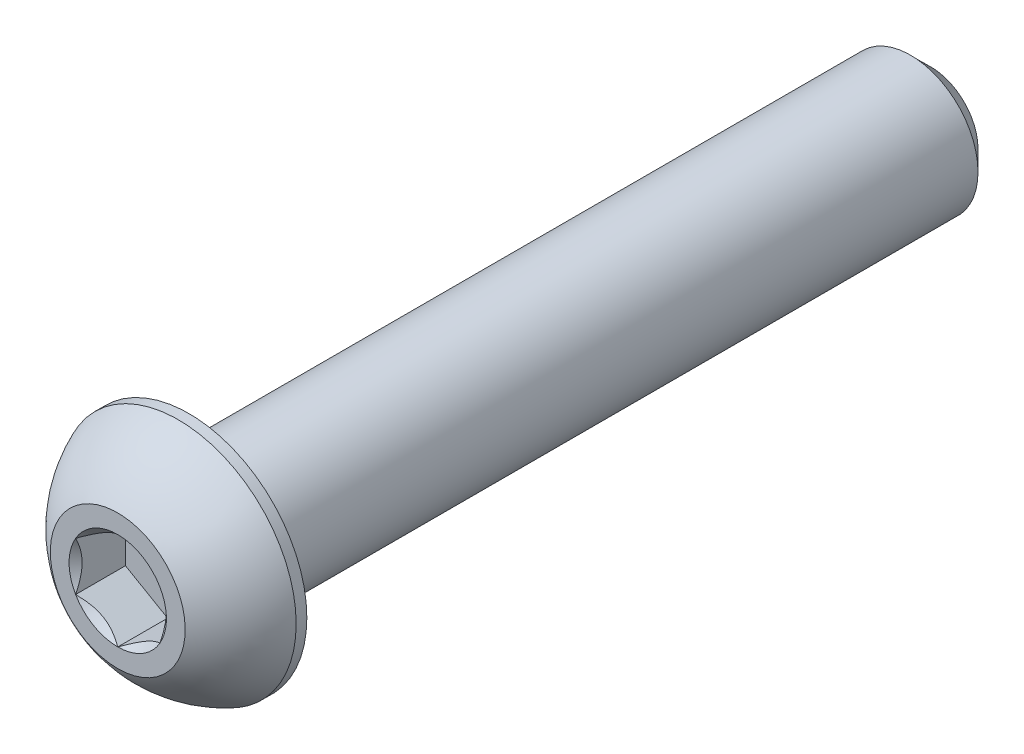
ISO-10303-21;
HEADER;
FILE_DESCRIPTION(('STEP AP214'),'2;1');
FILE_NAME('part.step','',(''),(''),'','','');
FILE_SCHEMA(('AUTOMOTIVE_DESIGN { 1 0 10303 214 1 1 1 1 }'));
ENDSEC;
DATA;
#1=APPLICATION_CONTEXT('core data for automotive mechanical design processes');
#2=APPLICATION_PROTOCOL_DEFINITION('international standard','automotive_design',2000,#1);
#3=PRODUCT_CONTEXT('',#1,'mechanical');
#4=PRODUCT('Part','Part','',(#3));
#5=PRODUCT_RELATED_PRODUCT_CATEGORY('part','',(#4));
#6=PRODUCT_DEFINITION_FORMATION('','',#4);
#7=PRODUCT_DEFINITION_CONTEXT('part definition',#1,'design');
#8=PRODUCT_DEFINITION('design','',#6,#7);
#9=PRODUCT_DEFINITION_SHAPE('','',#8);
#10=(LENGTH_UNIT() NAMED_UNIT(*) SI_UNIT(.MILLI.,.METRE.));
#11=(NAMED_UNIT(*) PLANE_ANGLE_UNIT() SI_UNIT($,.RADIAN.));
#12=(NAMED_UNIT(*) SI_UNIT($,.STERADIAN.) SOLID_ANGLE_UNIT());
#13=UNCERTAINTY_MEASURE_WITH_UNIT(LENGTH_MEASURE(1.E-05),#10,'distance_accuracy_value','');
#14=(GEOMETRIC_REPRESENTATION_CONTEXT(3) GLOBAL_UNCERTAINTY_ASSIGNED_CONTEXT((#13)) GLOBAL_UNIT_ASSIGNED_CONTEXT((#10,
#11,#12)) REPRESENTATION_CONTEXT('',''));
#15=CARTESIAN_POINT('',(0.,0.,0.));
#16=DIRECTION('',(0.,0.,1.));
#17=DIRECTION('',(1.,0.,0.));
#18=AXIS2_PLACEMENT_3D('',#15,#16,#17);
#19=CARTESIAN_POINT('',(0.,-3.175,-38.2778));
#20=DIRECTION('',(0.,0.,-1.));
#21=DIRECTION('',(0.,1.,0.));
#22=AXIS2_PLACEMENT_3D('',#19,#20,#21);
#23=PLANE('',#22);
#24=CARTESIAN_POINT('',(0.,0.,-38.2778));
#25=DIRECTION('',(0.,0.,-1.));
#26=DIRECTION('',(0.,1.,0.));
#27=AXIS2_PLACEMENT_3D('',#24,#25,#26);
#28=CIRCLE('',#27,2.2225);
#29=CARTESIAN_POINT('',(0.,-2.22249999999999,-38.2778));
#30=VERTEX_POINT('',#29);
#31=EDGE_CURVE('E181',#30,#30,#28,.T.);
#32=ORIENTED_EDGE('',*,*,#31,.T.);
#33=EDGE_LOOP('',(#32));
#34=FACE_BOUND('',#33,.T.);
#35=ADVANCED_FACE('F41',(#34),#23,.T.);
#36=CARTESIAN_POINT('',(0.,0.,-38.2778));
#37=DIRECTION('',(0.,0.,-1.));
#38=DIRECTION('',(0.,1.,0.));
#39=AXIS2_PLACEMENT_3D('',#36,#37,#38);
#40=CYLINDRICAL_SURFACE('',#39,3.175);
#41=CARTESIAN_POINT('',(0.,0.,-37.3253));
#42=DIRECTION('',(0.,0.,-1.));
#43=DIRECTION('',(0.,1.,0.));
#44=AXIS2_PLACEMENT_3D('',#41,#42,#43);
#45=CIRCLE('',#44,3.175);
#46=CARTESIAN_POINT('',(0.,-3.175,-37.3253));
#47=VERTEX_POINT('',#46);
#48=EDGE_CURVE('E55',#47,#47,#45,.F.);
#49=ORIENTED_EDGE('',*,*,#48,.T.);
#50=EDGE_LOOP('',(#49));
#51=FACE_BOUND('',#50,.T.);
#52=CARTESIAN_POINT('',(0.,0.,-3.3528));
#53=DIRECTION('',(0.,0.,1.));
#54=DIRECTION('',(1.,0.,0.));
#55=AXIS2_PLACEMENT_3D('',#52,#53,#54);
#56=CIRCLE('',#55,3.175);
#57=CARTESIAN_POINT('',(3.175,0.,-3.3528));
#58=VERTEX_POINT('',#57);
#59=EDGE_CURVE('E178',#58,#58,#56,.F.);
#60=ORIENTED_EDGE('',*,*,#59,.T.);
#61=EDGE_LOOP('',(#60));
#62=FACE_BOUND('',#61,.T.);
#63=ADVANCED_FACE('F186',(#51,#62),#40,.T.);
#64=CARTESIAN_POINT('',(0.,0.,-38.2778));
#65=DIRECTION('',(0.,0.,1.));
#66=DIRECTION('',(0.,-1.,0.));
#67=AXIS2_PLACEMENT_3D('',#64,#65,#66);
#68=CONICAL_SURFACE('',#67,2.2225,0.785398163397449);
#69=CARTESIAN_POINT('',(0.,-3.175,-37.3253));
#70=CARTESIAN_POINT('',(0.,-3.165078125,-37.335221875));
#71=CARTESIAN_POINT('',(0.,-3.15515625,-37.34514375));
#72=CARTESIAN_POINT('',(0.,-3.1353125,-37.3649875));
#73=CARTESIAN_POINT('',(0.,-3.125390625,-37.374909375));
#74=CARTESIAN_POINT('',(0.,-3.105546875,-37.394753125));
#75=CARTESIAN_POINT('',(0.,-3.095625,-37.404675));
#76=CARTESIAN_POINT('',(0.,-3.07578125,-37.42451875));
#77=CARTESIAN_POINT('',(0.,-3.065859375,-37.434440625));
#78=CARTESIAN_POINT('',(0.,-3.046015625,-37.454284375));
#79=CARTESIAN_POINT('',(0.,-3.03609375,-37.46420625));
#80=CARTESIAN_POINT('',(0.,-3.01625,-37.48405));
#81=CARTESIAN_POINT('',(0.,-3.006328125,-37.493971875));
#82=CARTESIAN_POINT('',(0.,-2.986484375,-37.513815625));
#83=CARTESIAN_POINT('',(0.,-2.9765625,-37.5237375));
#84=CARTESIAN_POINT('',(0.,-2.95671875,-37.54358125));
#85=CARTESIAN_POINT('',(0.,-2.946796875,-37.553503125));
#86=CARTESIAN_POINT('',(0.,-2.926953125,-37.573346875));
#87=CARTESIAN_POINT('',(0.,-2.91703125,-37.58326875));
#88=CARTESIAN_POINT('',(0.,-2.8971875,-37.6031125));
#89=CARTESIAN_POINT('',(0.,-2.887265625,-37.613034375));
#90=CARTESIAN_POINT('',(0.,-2.867421875,-37.632878125));
#91=CARTESIAN_POINT('',(0.,-2.8575,-37.6428));
#92=CARTESIAN_POINT('',(0.,-2.83765625,-37.66264375));
#93=CARTESIAN_POINT('',(0.,-2.827734375,-37.672565625));
#94=CARTESIAN_POINT('',(0.,-2.807890625,-37.692409375));
#95=CARTESIAN_POINT('',(0.,-2.79796875,-37.70233125));
#96=CARTESIAN_POINT('',(0.,-2.778125,-37.722175));
#97=CARTESIAN_POINT('',(0.,-2.768203125,-37.732096875));
#98=CARTESIAN_POINT('',(0.,-2.748359375,-37.751940625));
#99=CARTESIAN_POINT('',(0.,-2.7384375,-37.7618625));
#100=CARTESIAN_POINT('',(0.,-2.71859375,-37.78170625));
#101=CARTESIAN_POINT('',(0.,-2.708671875,-37.791628125));
#102=CARTESIAN_POINT('',(0.,-2.688828125,-37.811471875));
#103=CARTESIAN_POINT('',(0.,-2.67890624999999,-37.82139375));
#104=CARTESIAN_POINT('',(0.,-2.6590625,-37.8412375));
#105=CARTESIAN_POINT('',(0.,-2.649140625,-37.851159375));
#106=CARTESIAN_POINT('',(0.,-2.629296875,-37.871003125));
#107=CARTESIAN_POINT('',(0.,-2.619375,-37.880925));
#108=CARTESIAN_POINT('',(0.,-2.59953125,-37.90076875));
#109=CARTESIAN_POINT('',(0.,-2.589609375,-37.910690625));
#110=CARTESIAN_POINT('',(0.,-2.569765625,-37.930534375));
#111=CARTESIAN_POINT('',(0.,-2.55984375,-37.94045625));
#112=CARTESIAN_POINT('',(0.,-2.54,-37.9603));
#113=CARTESIAN_POINT('',(0.,-2.53007812499999,-37.970221875));
#114=CARTESIAN_POINT('',(0.,-2.510234375,-37.990065625));
#115=CARTESIAN_POINT('',(0.,-2.5003125,-37.9999875));
#116=CARTESIAN_POINT('',(0.,-2.48046875,-38.01983125));
#117=CARTESIAN_POINT('',(0.,-2.47054687499999,-38.029753125));
#118=CARTESIAN_POINT('',(0.,-2.45070312499999,-38.049596875));
#119=CARTESIAN_POINT('',(0.,-2.44078125,-38.05951875));
#120=CARTESIAN_POINT('',(0.,-2.4209375,-38.0793625));
#121=CARTESIAN_POINT('',(0.,-2.411015625,-38.089284375));
#122=CARTESIAN_POINT('',(0.,-2.391171875,-38.109128125));
#123=CARTESIAN_POINT('',(0.,-2.38124999999999,-38.11905));
#124=CARTESIAN_POINT('',(0.,-2.36140624999999,-38.13889375));
#125=CARTESIAN_POINT('',(0.,-2.351484375,-38.148815625));
#126=CARTESIAN_POINT('',(0.,-2.331640625,-38.168659375));
#127=CARTESIAN_POINT('',(0.,-2.32171874999999,-38.17858125));
#128=CARTESIAN_POINT('',(0.,-2.30187499999999,-38.198425));
#129=CARTESIAN_POINT('',(0.,-2.291953125,-38.208346875));
#130=CARTESIAN_POINT('',(0.,-2.272109375,-38.228190625));
#131=CARTESIAN_POINT('',(0.,-2.2621875,-38.2381125));
#132=CARTESIAN_POINT('',(0.,-2.24234374999999,-38.25795625));
#133=CARTESIAN_POINT('',(0.,-2.23242187499999,-38.267878125));
#134=CARTESIAN_POINT('',(0.,-2.22249999999999,-38.2778));
#135=B_SPLINE_CURVE_WITH_KNOTS('',3,(#69,#70,#71,#72,#73,#74,#75,#76,#77,#78,#79,#80,#81,#82,
#83,#84,#85,#86,#87,#88,#89,#90,#91,#92,#93,#94,#95,#96,#97,#98,#99,#100,#101,#102,#103,#104,
#105,#106,#107,#108,#109,#110,#111,#112,#113,#114,#115,#116,#117,#118,#119,#120,#121,#122,#123,
#124,#125,#126,#127,#128,#129,#130,#131,#132,#133,#134),.UNSPECIFIED.,.F.,.F.,(4,2,2,2,2,2,2,2,
2,2,2,2,2,2,2,2,2,2,2,2,2,2,2,2,2,2,2,2,2,2,2,2,4),(0.,0.0420949505675145,0.0841899011350244,
0.126284851702539,0.168379802270049,0.210474752837563,0.252569703405073,0.294664653972583,
0.336759604540098,0.378854555107608,0.420949505675122,0.463044456242632,0.505139406810142,
0.547234357377657,0.589329307945166,0.631424258512681,0.673519209080191,0.7156141596477,
0.757709110215215,0.799804060782725,0.84189901135024,0.883993961917749,0.926088912485259,
0.968183863052774,1.01027881362028,1.0523737641878,1.09446871475531,1.13656366532282,
1.17865861589033,1.22075356645784,1.26284851702536,1.30494346759287,1.34703841816038),.UNSPECIFIED.);
#136=EDGE_CURVE('BSEAM43',#47,#30,#135,.T.);
#137=ORIENTED_EDGE('',*,*,#48,.F.);
#138=ORIENTED_EDGE('',*,*,#31,.F.);
#139=ORIENTED_EDGE('',*,*,#136,.T.);
#140=ORIENTED_EDGE('',*,*,#136,.F.);
#141=EDGE_LOOP('',(#137,#139,#138,#140));
#142=FACE_BOUND('',#141,.T.);
#143=ADVANCED_FACE('F43',(#142),#68,.T.);
#144=CARTESIAN_POINT('',(0.,0.,-5.060315));
#145=DIRECTION('',(0.,0.,1.));
#146=DIRECTION('',(0.,-1.,0.));
#147=AXIS2_PLACEMENT_3D('',#144,#145,#146);
#148=SPHERICAL_SURFACE('',#147,5.97389428256184);
#149=CARTESIAN_POINT('',(0.,0.,0.));
#150=DIRECTION('',(0.,0.,1.));
#151=DIRECTION('',(1.,0.,0.));
#152=AXIS2_PLACEMENT_3D('',#149,#150,#151);
#153=CIRCLE('',#152,3.175);
#154=CARTESIAN_POINT('',(0.,-3.175,0.));
#155=VERTEX_POINT('',#154);
#156=EDGE_CURVE('E175',#155,#155,#153,.T.);
#157=CARTESIAN_POINT('',(0.,0.,-2.84988));
#158=DIRECTION('',(0.,0.,1.));
#159=DIRECTION('',(1.,0.,0.));
#160=AXIS2_PLACEMENT_3D('',#157,#158,#159);
#161=CIRCLE('',#160,5.5499);
#162=CARTESIAN_POINT('',(0.,-5.5499,-2.84988));
#163=VERTEX_POINT('',#162);
#164=EDGE_CURVE('E169',#163,#163,#161,.T.);
#165=CARTESIAN_POINT('',(0.,-3.175,0.));
#166=CARTESIAN_POINT('',(0.,-3.20828343957184,-0.0208830076580488));
#167=CARTESIAN_POINT('',(0.,-3.24136078860705,-0.0420944789280492));
#168=CARTESIAN_POINT('',(0.,-3.3070905577514,-0.0851658910984713));
#169=CARTESIAN_POINT('',(0.,-3.33974297786056,-0.107025831998893));
#170=CARTESIAN_POINT('',(0.,-3.40461014130008,-0.151385725836676));
#171=CARTESIAN_POINT('',(0.,-3.43682488463043,-0.173885678774038));
#172=CARTESIAN_POINT('',(0.,-3.50080416139461,-0.219516822259478));
#173=CARTESIAN_POINT('',(0.,-3.53256869482844,-0.242648012807557));
#174=CARTESIAN_POINT('',(0.,-3.59563518208834,-0.289532629449102));
#175=CARTESIAN_POINT('',(0.,-3.62693713591442,-0.313286055542568));
#176=CARTESIAN_POINT('',(0.,-3.68906627753106,-0.361405894091329));
#177=CARTESIAN_POINT('',(0.,-3.71989346532163,-0.385772306546625));
#178=CARTESIAN_POINT('',(0.,-3.78106107243204,-0.435108631276876));
#179=CARTESIAN_POINT('',(0.,-3.81140149175189,-0.460078543551832));
#180=CARTESIAN_POINT('',(0.,-3.87158374923259,-0.510612146063937));
#181=CARTESIAN_POINT('',(0.,-3.90142558739343,-0.536175836301086));
#182=CARTESIAN_POINT('',(0.,-3.96059906392414,-0.587887041792083));
#183=CARTESIAN_POINT('',(0.,-3.989930702294,-0.614034557045931));
#184=CARTESIAN_POINT('',(0.,-4.04807235926832,-0.666903232293406));
#185=CARTESIAN_POINT('',(0.,-4.07688237787279,-0.693624392287033));
#186=CARTESIAN_POINT('',(0.,-4.13396957842491,-0.747629953401057));
#187=CARTESIAN_POINT('',(0.,-4.16224676037256,-0.774914354521453));
#188=CARTESIAN_POINT('',(0.,-4.21825727817542,-0.830035774981947));
#189=CARTESIAN_POINT('',(0.,-4.24599061403061,-0.857872794322044));
#190=CARTESIAN_POINT('',(0.,-4.30090264195357,-0.91408861315902));
#191=CARTESIAN_POINT('',(0.,-4.32808133402134,-0.942467412655899));
#192=CARTESIAN_POINT('',(0.,-4.38187349261952,-0.999755742806741));
#193=CARTESIAN_POINT('',(0.,-4.40848695914995,-1.0286652734607));
#194=CARTESIAN_POINT('',(0.,-4.46113830498838,-1.08700381029123));
#195=CARTESIAN_POINT('',(0.,-4.48717618429639,-1.11643281646778));
#196=CARTESIAN_POINT('',(0.,-4.53866621810402,-1.17579884645643));
#197=CARTESIAN_POINT('',(0.,-4.56411837260364,-1.20573587026853));
#198=CARTESIAN_POINT('',(0.,-4.61442704725457,-1.26610627984964));
#199=CARTESIAN_POINT('',(0.,-4.63928356740587,-1.29653966561866));
#200=CARTESIAN_POINT('',(0.,-4.68839129572448,-1.3578909501815));
#201=CARTESIAN_POINT('',(0.,-4.71264250389178,-1.38880884897531));
#202=CARTESIAN_POINT('',(0.,-4.76053016627881,-1.45111712201534));
#203=CARTESIAN_POINT('',(0.,-4.78416662049853,-1.48250749626155));
#204=CARTESIAN_POINT('',(0.,-4.8308155723751,-1.54574849868041));
#205=CARTESIAN_POINT('',(0.,-4.85382807003194,-1.57759912685306));
#206=CARTESIAN_POINT('',(0.,-4.89922014909859,-1.64174823640362));
#207=CARTESIAN_POINT('',(0.,-4.92159973050841,-1.67404671778154));
#208=CARTESIAN_POINT('',(0.,-4.96571726381658,-1.73907895865427));
#209=CARTESIAN_POINT('',(0.,-4.98745521571493,-1.77181271814908));
#210=CARTESIAN_POINT('',(0.,-5.03028102654719,-1.83770277069632));
#211=CARTESIAN_POINT('',(0.,-5.0513688854811,-1.87085906374874));
#212=CARTESIAN_POINT('',(0.,-5.09288630004063,-1.93758127434189));
#213=CARTESIAN_POINT('',(0.,-5.11331585566624,-1.97114719188261));
#214=CARTESIAN_POINT('',(0.,-5.15350870956168,-2.03867558290299));
#215=CARTESIAN_POINT('',(0.,-5.17327200783151,-2.07263805638265));
#216=CARTESIAN_POINT('',(0.,-5.21212465239608,-2.14094633632486));
#217=CARTESIAN_POINT('',(0.,-5.23121399869082,-2.17529214278741));
#218=CARTESIAN_POINT('',(0.,-5.26871130697935,-2.2443537165359));
#219=CARTESIAN_POINT('',(0.,-5.28711926897315,-2.27906948382184));
#220=CARTESIAN_POINT('',(0.,-5.32324664200827,-2.3488574628552));
#221=CARTESIAN_POINT('',(0.,-5.3409660530496,-2.38392967460262));
#222=CARTESIAN_POINT('',(0.,-5.37570942417474,-2.45441688802313));
#223=CARTESIAN_POINT('',(0.,-5.39273338425856,-2.48983188969622));
#224=CARTESIAN_POINT('',(0.,-5.42607922958184,-2.56099089271574));
#225=CARTESIAN_POINT('',(0.,-5.44240111482132,-2.59673489406217));
#226=CARTESIAN_POINT('',(0.,-5.47433643994316,-2.66853798649801));
#227=CARTESIAN_POINT('',(0.,-5.48994987982553,-2.70459707758742));
#228=CARTESIAN_POINT('',(0.,-5.52046229408188,-2.77701628549785));
#229=CARTESIAN_POINT('',(0.,-5.53536126845586,-2.81337640231887));
#230=CARTESIAN_POINT('',(0.,-5.5499,-2.84988));
#231=B_SPLINE_CURVE_WITH_KNOTS('',3,(#165,#166,#167,#168,#169,#170,#171,#172,#173,#174,#175,
#176,#177,#178,#179,#180,#181,#182,#183,#184,#185,#186,#187,#188,#189,#190,#191,#192,#193,#194,
#195,#196,#197,#198,#199,#200,#201,#202,#203,#204,#205,#206,#207,#208,#209,#210,#211,#212,#213,
#214,#215,#216,#217,#218,#219,#220,#221,#222,#223,#224,#225,#226,#227,#228,#229,#230),
.UNSPECIFIED.,.F.,.F.,(4,2,2,2,2,2,2,2,2,2,2,2,2,2,2,2,2,2,2,2,2,2,2,2,2,2,2,2,2,2,2,2,4),(0.,
0.1178750807537,0.2357501615074,0.353625242261099,0.471500323014799,0.589375403768499,
0.707250484522198,0.825125565275897,0.943000646029598,1.0608757267833,1.178750807537,
1.2966258882907,1.41450096904439,1.53237604979809,1.65025113055179,1.76812621130549,
1.88600129205919,2.00387637281289,2.12175145356659,2.23962653432029,2.35750161507399,
2.47537669582769,2.59325177658139,2.71112685733509,2.82900193808879,2.94687701884249,
3.06475209959619,3.18262718034989,3.30050226110359,3.41837734185729,3.53625242261099,
3.65412750336469,3.77200258411839),.UNSPECIFIED.);
#232=EDGE_CURVE('BSEAM191',#155,#163,#231,.T.);
#233=ORIENTED_EDGE('',*,*,#156,.F.);
#234=ORIENTED_EDGE('',*,*,#164,.T.);
#235=ORIENTED_EDGE('',*,*,#232,.T.);
#236=ORIENTED_EDGE('',*,*,#232,.F.);
#237=EDGE_LOOP('',(#233,#235,#234,#236));
#238=FACE_BOUND('',#237,.T.);
#239=ADVANCED_FACE('F191',(#238),#148,.T.);
#240=CARTESIAN_POINT('',(0.,-3.175,0.));
#241=DIRECTION('',(0.,0.,-1.));
#242=DIRECTION('',(-1.,0.,0.));
#243=AXIS2_PLACEMENT_3D('',#240,#241,#242);
#244=PLANE('',#243);
#245=CARTESIAN_POINT('',(0.,0.,0.));
#246=DIRECTION('',(0.,0.,1.));
#247=DIRECTION('',(1.,0.,0.));
#248=AXIS2_PLACEMENT_3D('',#245,#246,#247);
#249=CIRCLE('',#248,2.29135888084633);
#250=CARTESIAN_POINT('',(-1.984375,1.14567944042316,0.));
#251=VERTEX_POINT('',#250);
#252=CARTESIAN_POINT('',(-1.984375,-1.14567944042316,0.));
#253=VERTEX_POINT('',#252);
#254=EDGE_CURVE('E68',#251,#253,#249,.T.);
#255=ORIENTED_EDGE('',*,*,#254,.F.);
#256=CARTESIAN_POINT('',(0.,2.29135888084633,0.));
#257=VERTEX_POINT('',#256);
#258=EDGE_CURVE('E140',#257,#251,#249,.T.);
#259=ORIENTED_EDGE('',*,*,#258,.F.);
#260=CARTESIAN_POINT('',(1.984375,1.14567944042316,0.));
#261=VERTEX_POINT('',#260);
#262=EDGE_CURVE('E137',#261,#257,#249,.T.);
#263=ORIENTED_EDGE('',*,*,#262,.F.);
#264=CARTESIAN_POINT('',(1.984375,-1.14567944042316,0.));
#265=VERTEX_POINT('',#264);
#266=EDGE_CURVE('E108',#265,#261,#249,.T.);
#267=ORIENTED_EDGE('',*,*,#266,.F.);
#268=CARTESIAN_POINT('',(0.,-2.29135888084633,0.));
#269=VERTEX_POINT('',#268);
#270=EDGE_CURVE('E100',#269,#265,#249,.T.);
#271=ORIENTED_EDGE('',*,*,#270,.F.);
#272=EDGE_CURVE('E61',#253,#269,#249,.T.);
#273=ORIENTED_EDGE('',*,*,#272,.F.);
#274=EDGE_LOOP('',(#255,#259,#263,#267,#271,#273));
#275=FACE_BOUND('',#274,.T.);
#276=ORIENTED_EDGE('',*,*,#156,.T.);
#277=EDGE_LOOP('',(#276));
#278=FACE_BOUND('',#277,.T.);
#279=ADVANCED_FACE('F134',(#275,#278),#244,.F.);
#280=CARTESIAN_POINT('',(0.,-5.5499,-3.3528));
#281=DIRECTION('',(0.,0.,1.));
#282=DIRECTION('',(1.,0.,0.));
#283=AXIS2_PLACEMENT_3D('',#280,#281,#282);
#284=PLANE('',#283);
#285=ORIENTED_EDGE('',*,*,#59,.F.);
#286=EDGE_LOOP('',(#285));
#287=FACE_BOUND('',#286,.T.);
#288=CARTESIAN_POINT('',(0.,0.,-3.3528));
#289=DIRECTION('',(0.,0.,1.));
#290=DIRECTION('',(1.,0.,0.));
#291=AXIS2_PLACEMENT_3D('',#288,#289,#290);
#292=CIRCLE('',#291,5.5499);
#293=CARTESIAN_POINT('',(5.5499,0.,-3.3528));
#294=VERTEX_POINT('',#293);
#295=EDGE_CURVE('E172',#294,#294,#292,.T.);
#296=ORIENTED_EDGE('',*,*,#295,.F.);
#297=EDGE_LOOP('',(#296));
#298=FACE_BOUND('',#297,.T.);
#299=ADVANCED_FACE('F205',(#287,#298),#284,.F.);
#300=CARTESIAN_POINT('',(0.,0.,0.));
#301=DIRECTION('',(0.,0.,1.));
#302=DIRECTION('',(1.,0.,0.));
#303=AXIS2_PLACEMENT_3D('',#300,#301,#302);
#304=CYLINDRICAL_SURFACE('',#303,5.5499);
#305=ORIENTED_EDGE('',*,*,#164,.F.);
#306=EDGE_LOOP('',(#305));
#307=FACE_BOUND('',#306,.T.);
#308=ORIENTED_EDGE('',*,*,#295,.T.);
#309=EDGE_LOOP('',(#308));
#310=FACE_BOUND('',#309,.T.);
#311=ADVANCED_FACE('F208',(#307,#310),#304,.T.);
#312=CARTESIAN_POINT('',(0.,0.,0.));
#313=DIRECTION('',(0.,0.,1.));
#314=DIRECTION('',(1.,0.,0.));
#315=AXIS2_PLACEMENT_3D('',#312,#313,#314);
#316=CONICAL_SURFACE('',#315,2.29135888084633,0.78539816339745);
#317=ORIENTED_EDGE('',*,*,#266,.T.);
#318=CARTESIAN_POINT('',(1.984375,-2.28495242157822,0.734984078816568));
#319=CARTESIAN_POINT('',(1.984375,-2.22931635455402,0.692986685550761));
#320=CARTESIAN_POINT('',(1.984375,-2.17336876548389,0.651396054076336));
#321=CARTESIAN_POINT('',(1.984375,-2.06072770258171,0.569208461471479));
#322=CARTESIAN_POINT('',(1.984375,-2.00403404503435,0.528611752405042));
#323=CARTESIAN_POINT('',(1.984375,-1.88936329173488,0.448303503174669));
#324=CARTESIAN_POINT('',(1.984375,-1.83137965519348,0.408601258813307));
#325=CARTESIAN_POINT('',(1.984375,-1.7144280213784,0.330685173401292));
#326=CARTESIAN_POINT('',(1.984375,-1.65546009407228,0.292471227194368));
#327=CARTESIAN_POINT('',(1.984375,-1.47005472306035,0.176252834013636));
#328=CARTESIAN_POINT('',(1.984375,-1.34163909427883,0.101347886872381));
#329=CARTESIAN_POINT('',(1.984375,-1.0784038470548,-0.0356697845602626));
#330=CARTESIAN_POINT('',(1.984375,-0.943607781407425,-0.0978256335176257));
#331=CARTESIAN_POINT('',(1.984375,-0.741275100444882,-0.173867421311381));
#332=CARTESIAN_POINT('',(1.984375,-0.676735408881095,-0.195691938673995));
#333=CARTESIAN_POINT('',(1.984375,-0.546098118112762,-0.234159536462205));
#334=CARTESIAN_POINT('',(1.984375,-0.480000411919956,-0.250802259934452));
#335=CARTESIAN_POINT('',(1.984375,-0.347746170028532,-0.277764619130277));
#336=CARTESIAN_POINT('',(1.984375,-0.281612071479123,-0.288192590264108));
#337=CARTESIAN_POINT('',(1.984375,-0.14863662005235,-0.302521852623404));
#338=CARTESIAN_POINT('',(1.984375,-0.0817953907393235,-0.306424265772614));
#339=CARTESIAN_POINT('',(1.984375,0.0495156750890646,-0.307412948667328));
#340=CARTESIAN_POINT('',(1.984375,0.113983775102992,-0.304740821124985));
#341=CARTESIAN_POINT('',(1.984375,0.242367515846177,-0.293260789502485));
#342=CARTESIAN_POINT('',(1.984375,0.30628310229592,-0.284452289360786));
#343=CARTESIAN_POINT('',(1.984375,0.434181040262184,-0.261030978667103));
#344=CARTESIAN_POINT('',(1.984375,0.498145026858309,-0.246319393767914));
#345=CARTESIAN_POINT('',(1.984375,0.624675616953007,-0.211873818587874));
#346=CARTESIAN_POINT('',(1.984375,0.687242336899689,-0.192140248550805));
#347=CARTESIAN_POINT('',(1.984375,0.884225483826087,-0.12258776276924));
#348=CARTESIAN_POINT('',(1.984375,1.01583674256468,-0.0648475887435035));
#349=CARTESIAN_POINT('',(1.984375,1.27288659242652,0.0635303365887973));
#350=CARTESIAN_POINT('',(1.984375,1.3983008827048,0.134214424919412));
#351=CARTESIAN_POINT('',(1.984375,1.57956687990221,0.244516663813198));
#352=CARTESIAN_POINT('',(1.984375,1.63738271299424,0.280969829475363));
#353=CARTESIAN_POINT('',(1.984375,1.75202215386201,0.355415963291704));
#354=CARTESIAN_POINT('',(1.984375,1.80884568601361,0.393409048078053));
#355=CARTESIAN_POINT('',(1.984375,1.92116923084255,0.470338808893089));
#356=CARTESIAN_POINT('',(1.984375,1.97667624512253,0.50926531303879));
#357=CARTESIAN_POINT('',(1.984375,2.08693170717166,0.588147746121385));
#358=CARTESIAN_POINT('',(1.984375,2.14168035934792,0.628103389024029));
#359=CARTESIAN_POINT('',(1.984375,2.19611149046622,0.668480611285425));
#360=B_SPLINE_CURVE_WITH_KNOTS('',3,(#318,#319,#320,#321,#322,#323,#324,#325,#326,#327,#328,
#329,#330,#331,#332,#333,#334,#335,#336,#337,#338,#339,#340,#341,#342,#343,#344,#345,#346,#347,
#348,#349,#350,#351,#352,#353,#354,#355,#356,#357,#358,#359),.UNSPECIFIED.,.F.,.F.,(4,2,2,2,2,2,
2,2,2,2,2,2,2,2,2,2,2,2,2,2,4),(0.,0.209126070008322,0.418304637356569,0.629103979977992,
0.839888401371185,1.28549951116127,1.72957750768351,1.93379389749971,2.13802435186698,
2.33858179514334,2.53910475350639,2.73236963400794,2.92565329006887,3.12231577097487,
3.31896180041345,3.74886295245172,4.18033428125362,4.3853601718029,4.59040161996382,
4.79377749165107,4.99709743524131),.UNSPECIFIED.);
#361=EDGE_CURVE('E11',#265,#261,#360,.T.);
#362=ORIENTED_EDGE('',*,*,#361,.F.);
#363=EDGE_LOOP('',(#317,#362));
#364=FACE_BOUND('',#363,.T.);
#365=ADVANCED_FACE('F112',(#364),#316,.F.);
#366=ORIENTED_EDGE('',*,*,#262,.T.);
#367=CARTESIAN_POINT('',(1.984575,1.14556397036933,0.000115478781843379));
#368=CARTESIAN_POINT('',(1.9163590048332,1.18494849354192,-0.0392371477360852));
#369=CARTESIAN_POINT('',(1.84700231489303,1.22499159714897,-0.0762786895538154));
#370=CARTESIAN_POINT('',(1.70557619954781,1.30664400291398,-0.144101141576677));
#371=CARTESIAN_POINT('',(1.63349332126322,1.34826107209555,-0.174844310908246));
#372=CARTESIAN_POINT('',(1.488141602734,1.43217992591557,-0.227508111188786));
#373=CARTESIAN_POINT('',(1.41490978751306,1.47446033414663,-0.249561124120036));
#374=CARTESIAN_POINT('',(1.26683381740529,1.55995203534886,-0.283538507056124));
#375=CARTESIAN_POINT('',(1.19199418724658,1.60316071596705,-0.295488243908272));
#376=CARTESIAN_POINT('',(1.06301458545618,1.6776271237807,-0.306269900918094));
#377=CARTESIAN_POINT('',(1.00904128422756,1.7087886237741,-0.30786610094093));
#378=CARTESIAN_POINT('',(0.901182881480199,1.77106070163465,-0.305178161134708));
#379=CARTESIAN_POINT('',(0.847297817514476,1.80217125782056,-0.300891959659541));
#380=CARTESIAN_POINT('',(0.740036461751395,1.86409863044402,-0.286683126986481));
#381=CARTESIAN_POINT('',(0.686660807239859,1.89491507894443,-0.276754189547727));
#382=CARTESIAN_POINT('',(0.580832482591103,1.95601509066828,-0.251804915725461));
#383=CARTESIAN_POINT('',(0.528379742028898,1.9862986945516,-0.236784969610512));
#384=CARTESIAN_POINT('',(0.394017661036351,2.06387267818152,-0.19219214836433));
#385=CARTESIAN_POINT('',(0.312941642841675,2.11068193911104,-0.159257004061668));
#386=CARTESIAN_POINT('',(0.19372669327016,2.17951072233758,-0.103657558797803));
#387=CARTESIAN_POINT('',(0.154440075613998,2.20219286161692,-0.0841224079481377));
#388=CARTESIAN_POINT('',(0.0765946381319466,2.24713694590237,-0.0432712618805983));
#389=CARTESIAN_POINT('',(0.0380353888983007,2.26939913882716,-0.0219563604316494));
#390=CARTESIAN_POINT('',(-0.000200000000000694,2.29147435090017,0.000115478781842942));
#391=B_SPLINE_CURVE_WITH_KNOTS('',3,(#367,#368,#369,#370,#371,#372,#373,#374,#375,#376,#377,
#378,#379,#380,#381,#382,#383,#384,#385,#386,#387,#388,#389,#390),.UNSPECIFIED.,.F.,.F.,(4,2,2,
2,2,2,2,2,2,2,2,4),(0.,0.264339630306627,0.530219665093694,0.791876416371461,1.05287424418109,
1.239639843932,1.42647091743852,1.61351120244035,1.8005371524754,2.09764209964316,
2.24579179873714,2.39385111134157),.UNSPECIFIED.);
#392=EDGE_CURVE('E139',#261,#257,#391,.T.);
#393=ORIENTED_EDGE('',*,*,#392,.F.);
#394=EDGE_LOOP('',(#366,#393));
#395=FACE_BOUND('',#394,.T.);
#396=ADVANCED_FACE('F293',(#395),#316,.F.);
#397=ORIENTED_EDGE('',*,*,#258,.T.);
#398=CARTESIAN_POINT('',(0.000199999999999584,2.29147435090017,0.000115478781843248));
#399=CARTESIAN_POINT('',(-0.0680159951668027,2.25208982772757,-0.0392371477360854));
#400=CARTESIAN_POINT('',(-0.137372685106966,2.21204672412052,-0.0762786895538155));
#401=CARTESIAN_POINT('',(-0.278798800452188,2.13039431835551,-0.144101141576677));
#402=CARTESIAN_POINT('',(-0.350881678736783,2.08877724917394,-0.174844310908246));
#403=CARTESIAN_POINT('',(-0.496233397266004,2.00485839535392,-0.227508111188786));
#404=CARTESIAN_POINT('',(-0.569465212486939,1.96257798712287,-0.249561124120036));
#405=CARTESIAN_POINT('',(-0.717541182594707,1.87708628592063,-0.283538507056124));
#406=CARTESIAN_POINT('',(-0.792380812753425,1.83387760530244,-0.295488243908272));
#407=CARTESIAN_POINT('',(-0.921360414543816,1.75941119748879,-0.306269900918094));
#408=CARTESIAN_POINT('',(-0.975333715772443,1.72824969749539,-0.307866100940931));
#409=CARTESIAN_POINT('',(-1.0831921185198,1.66597761963484,-0.305178161134708));
#410=CARTESIAN_POINT('',(-1.13707718248552,1.63486706344893,-0.300891959659541));
#411=CARTESIAN_POINT('',(-1.2443385382486,1.57293969082547,-0.286683126986481));
#412=CARTESIAN_POINT('',(-1.29771419276014,1.54212324232506,-0.276754189547727));
#413=CARTESIAN_POINT('',(-1.4035425174089,1.48102323060122,-0.251804915725462));
#414=CARTESIAN_POINT('',(-1.4559952579711,1.45073962671789,-0.236784969610512));
#415=CARTESIAN_POINT('',(-1.59035733896365,1.37316564308797,-0.19219214836433));
#416=CARTESIAN_POINT('',(-1.67143335715832,1.32635638215845,-0.159257004061668));
#417=CARTESIAN_POINT('',(-1.79064830672984,1.25752759893191,-0.103657558797804));
#418=CARTESIAN_POINT('',(-1.829934924386,1.23484545965257,-0.0841224079481378));
#419=CARTESIAN_POINT('',(-1.90778036186805,1.18990137536712,-0.0432712618805986));
#420=CARTESIAN_POINT('',(-1.9463396111017,1.16763918244233,-0.0219563604316498));
#421=CARTESIAN_POINT('',(-1.984575,1.14556397036933,0.000115478781842511));
#422=B_SPLINE_CURVE_WITH_KNOTS('',3,(#398,#399,#400,#401,#402,#403,#404,#405,#406,#407,#408,
#409,#410,#411,#412,#413,#414,#415,#416,#417,#418,#419,#420,#421),.UNSPECIFIED.,.F.,.F.,(4,2,2,
2,2,2,2,2,2,2,2,4),(0.,0.264339630306627,0.530219665093694,0.791876416371461,1.05287424418109,
1.239639843932,1.42647091743852,1.61351120244035,1.8005371524754,2.09764209964316,
2.24579179873714,2.39385111134157),.UNSPECIFIED.);
#423=EDGE_CURVE('E144',#257,#251,#422,.T.);
#424=ORIENTED_EDGE('',*,*,#423,.F.);
#425=EDGE_LOOP('',(#397,#424));
#426=FACE_BOUND('',#425,.T.);
#427=ADVANCED_FACE('F147',(#426),#316,.F.);
#428=ORIENTED_EDGE('',*,*,#254,.T.);
#429=CARTESIAN_POINT('',(-1.984375,-2.28495242157822,0.734984078816568));
#430=CARTESIAN_POINT('',(-1.984375,-2.22931635455402,0.692986685550762));
#431=CARTESIAN_POINT('',(-1.984375,-2.17336876548389,0.651396054076336));
#432=CARTESIAN_POINT('',(-1.984375,-2.06072770258171,0.569208461471479));
#433=CARTESIAN_POINT('',(-1.984375,-2.00403404503435,0.528611752405043));
#434=CARTESIAN_POINT('',(-1.984375,-1.88936329173489,0.448303503174669));
#435=CARTESIAN_POINT('',(-1.984375,-1.83137965519348,0.408601258813307));
#436=CARTESIAN_POINT('',(-1.984375,-1.7144280213784,0.330685173401292));
#437=CARTESIAN_POINT('',(-1.984375,-1.65546009407228,0.292471227194368));
#438=CARTESIAN_POINT('',(-1.984375,-1.47005472306035,0.176252834013636));
#439=CARTESIAN_POINT('',(-1.984375,-1.34163909427883,0.101347886872381));
#440=CARTESIAN_POINT('',(-1.984375,-1.0784038470548,-0.0356697845602625));
#441=CARTESIAN_POINT('',(-1.984375,-0.943607781407425,-0.0978256335176254));
#442=CARTESIAN_POINT('',(-1.984375,-0.741275100444882,-0.173867421311381));
#443=CARTESIAN_POINT('',(-1.984375,-0.676735408881095,-0.195691938673995));
#444=CARTESIAN_POINT('',(-1.984375,-0.546098118112762,-0.234159536462205));
#445=CARTESIAN_POINT('',(-1.984375,-0.480000411919956,-0.250802259934452));
#446=CARTESIAN_POINT('',(-1.984375,-0.347746170028532,-0.277764619130277));
#447=CARTESIAN_POINT('',(-1.984375,-0.281612071479123,-0.288192590264108));
#448=CARTESIAN_POINT('',(-1.984375,-0.14863662005235,-0.302521852623404));
#449=CARTESIAN_POINT('',(-1.984375,-0.0817953907393238,-0.306424265772614));
#450=CARTESIAN_POINT('',(-1.984375,0.0495156750890643,-0.307412948667328));
#451=CARTESIAN_POINT('',(-1.984375,0.113983775102991,-0.304740821124985));
#452=CARTESIAN_POINT('',(-1.984375,0.242367515846177,-0.293260789502485));
#453=CARTESIAN_POINT('',(-1.984375,0.306283102295919,-0.284452289360786));
#454=CARTESIAN_POINT('',(-1.984375,0.434181040262184,-0.261030978667103));
#455=CARTESIAN_POINT('',(-1.984375,0.498145026858309,-0.246319393767914));
#456=CARTESIAN_POINT('',(-1.984375,0.624675616953007,-0.211873818587874));
#457=CARTESIAN_POINT('',(-1.984375,0.687242336899689,-0.192140248550805));
#458=CARTESIAN_POINT('',(-1.984375,0.884225483826087,-0.12258776276924));
#459=CARTESIAN_POINT('',(-1.984375,1.01583674256468,-0.0648475887435032));
#460=CARTESIAN_POINT('',(-1.984375,1.27288659242652,0.0635303365887978));
#461=CARTESIAN_POINT('',(-1.984375,1.3983008827048,0.134214424919412));
#462=CARTESIAN_POINT('',(-1.984375,1.57956687990221,0.244516663813198));
#463=CARTESIAN_POINT('',(-1.984375,1.63738271299424,0.280969829475363));
#464=CARTESIAN_POINT('',(-1.984375,1.75202215386202,0.355415963291704));
#465=CARTESIAN_POINT('',(-1.984375,1.80884568601362,0.393409048078053));
#466=CARTESIAN_POINT('',(-1.984375,1.92116923084255,0.47033880889309));
#467=CARTESIAN_POINT('',(-1.984375,1.97667624512253,0.509265313038791));
#468=CARTESIAN_POINT('',(-1.984375,2.08693170717166,0.588147746121386));
#469=CARTESIAN_POINT('',(-1.984375,2.14168035934793,0.628103389024029));
#470=CARTESIAN_POINT('',(-1.984375,2.19611149046622,0.668480611285426));
#471=B_SPLINE_CURVE_WITH_KNOTS('',3,(#429,#430,#431,#432,#433,#434,#435,#436,#437,#438,#439,
#440,#441,#442,#443,#444,#445,#446,#447,#448,#449,#450,#451,#452,#453,#454,#455,#456,#457,#458,
#459,#460,#461,#462,#463,#464,#465,#466,#467,#468,#469,#470),.UNSPECIFIED.,.F.,.F.,(4,2,2,2,2,2,
2,2,2,2,2,2,2,2,2,2,2,2,2,2,4),(0.,0.209126070008322,0.41830463735657,0.629103979977993,
0.839888401371186,1.28549951116127,1.72957750768351,1.93379389749972,2.13802435186698,
2.33858179514334,2.53910475350639,2.73236963400794,2.92565329006887,3.12231577097487,
3.31896180041345,3.74886295245172,4.18033428125362,4.3853601718029,4.59040161996383,
4.79377749165108,4.99709743524131),.UNSPECIFIED.);
#472=EDGE_CURVE('E151',#251,#253,#471,.F.);
#473=ORIENTED_EDGE('',*,*,#472,.F.);
#474=EDGE_LOOP('',(#428,#473));
#475=FACE_BOUND('',#474,.T.);
#476=ADVANCED_FACE('F287',(#475),#316,.F.);
#477=ORIENTED_EDGE('',*,*,#272,.T.);
#478=CARTESIAN_POINT('',(-1.984575,-1.14556397036933,0.000115478781842946));
#479=CARTESIAN_POINT('',(-1.9163590048332,-1.18494849354192,-0.0392371477360854));
#480=CARTESIAN_POINT('',(-1.84700231489303,-1.22499159714897,-0.0762786895538155));
#481=CARTESIAN_POINT('',(-1.70557619954781,-1.30664400291398,-0.144101141576677));
#482=CARTESIAN_POINT('',(-1.63349332126322,-1.34826107209555,-0.174844310908246));
#483=CARTESIAN_POINT('',(-1.488141602734,-1.43217992591557,-0.227508111188786));
#484=CARTESIAN_POINT('',(-1.41490978751306,-1.47446033414662,-0.249561124120036));
#485=CARTESIAN_POINT('',(-1.26683381740529,-1.55995203534886,-0.283538507056125));
#486=CARTESIAN_POINT('',(-1.19199418724658,-1.60316071596705,-0.295488243908272));
#487=CARTESIAN_POINT('',(-1.06301458545618,-1.6776271237807,-0.306269900918095));
#488=CARTESIAN_POINT('',(-1.00904128422756,-1.7087886237741,-0.307866100940931));
#489=CARTESIAN_POINT('',(-0.9011828814802,-1.77106070163465,-0.305178161134708));
#490=CARTESIAN_POINT('',(-0.847297817514477,-1.80217125782056,-0.300891959659541));
#491=CARTESIAN_POINT('',(-0.740036461751396,-1.86409863044402,-0.286683126986481));
#492=CARTESIAN_POINT('',(-0.68666080723986,-1.89491507894443,-0.276754189547728));
#493=CARTESIAN_POINT('',(-0.580832482591103,-1.95601509066827,-0.251804915725462));
#494=CARTESIAN_POINT('',(-0.528379742028898,-1.9862986945516,-0.236784969610513));
#495=CARTESIAN_POINT('',(-0.394017661036351,-2.06387267818152,-0.192192148364331));
#496=CARTESIAN_POINT('',(-0.312941642841675,-2.11068193911104,-0.159257004061668));
#497=CARTESIAN_POINT('',(-0.19372669327016,-2.17951072233758,-0.103657558797804));
#498=CARTESIAN_POINT('',(-0.154440075613998,-2.20219286161692,-0.0841224079481377));
#499=CARTESIAN_POINT('',(-0.0765946381319458,-2.24713694590237,-0.0432712618805983));
#500=CARTESIAN_POINT('',(-0.0380353888982999,-2.26939913882716,-0.0219563604316494));
#501=CARTESIAN_POINT('',(0.000200000000001552,-2.29147435090017,0.000115478781842944));
#502=B_SPLINE_CURVE_WITH_KNOTS('',3,(#478,#479,#480,#481,#482,#483,#484,#485,#486,#487,#488,
#489,#490,#491,#492,#493,#494,#495,#496,#497,#498,#499,#500,#501),.UNSPECIFIED.,.F.,.F.,(4,2,2,
2,2,2,2,2,2,2,2,4),(0.,0.264339630306627,0.530219665093694,0.79187641637146,1.05287424418109,
1.239639843932,1.42647091743852,1.61351120244035,1.8005371524754,2.09764209964316,
2.24579179873714,2.39385111134157),.UNSPECIFIED.);
#503=EDGE_CURVE('E124',#253,#269,#502,.T.);
#504=ORIENTED_EDGE('',*,*,#503,.F.);
#505=EDGE_LOOP('',(#477,#504));
#506=FACE_BOUND('',#505,.T.);
#507=ADVANCED_FACE('F235',(#506),#316,.F.);
#508=ORIENTED_EDGE('',*,*,#270,.T.);
#509=CARTESIAN_POINT('',(-0.000199999999998723,-2.29147435090017,0.000115478781843248));
#510=CARTESIAN_POINT('',(0.0680159951668037,-2.25208982772757,-0.0392371477360849));
#511=CARTESIAN_POINT('',(0.137372685106967,-2.21204672412052,-0.076278689553815));
#512=CARTESIAN_POINT('',(0.278798800452189,-2.13039431835551,-0.144101141576677));
#513=CARTESIAN_POINT('',(0.350881678736784,-2.08877724917394,-0.174844310908246));
#514=CARTESIAN_POINT('',(0.496233397266005,-2.00485839535392,-0.227508111188786));
#515=CARTESIAN_POINT('',(0.56946521248694,-1.96257798712287,-0.249561124120036));
#516=CARTESIAN_POINT('',(0.717541182594708,-1.87708628592063,-0.283538507056124));
#517=CARTESIAN_POINT('',(0.792380812753426,-1.83387760530244,-0.295488243908271));
#518=CARTESIAN_POINT('',(0.921360414543817,-1.75941119748879,-0.306269900918094));
#519=CARTESIAN_POINT('',(0.975333715772444,-1.72824969749539,-0.30786610094093));
#520=CARTESIAN_POINT('',(1.0831921185198,-1.66597761963484,-0.305178161134707));
#521=CARTESIAN_POINT('',(1.13707718248553,-1.63486706344893,-0.30089195965954));
#522=CARTESIAN_POINT('',(1.24433853824861,-1.57293969082547,-0.286683126986481));
#523=CARTESIAN_POINT('',(1.29771419276014,-1.54212324232506,-0.276754189547727));
#524=CARTESIAN_POINT('',(1.4035425174089,-1.48102323060122,-0.251804915725461));
#525=CARTESIAN_POINT('',(1.4559952579711,-1.45073962671789,-0.236784969610511));
#526=CARTESIAN_POINT('',(1.59035733896365,-1.37316564308797,-0.192192148364329));
#527=CARTESIAN_POINT('',(1.67143335715833,-1.32635638215845,-0.159257004061667));
#528=CARTESIAN_POINT('',(1.79064830672984,-1.25752759893191,-0.103657558797803));
#529=CARTESIAN_POINT('',(1.829934924386,-1.23484545965257,-0.0841224079481373));
#530=CARTESIAN_POINT('',(1.90778036186805,-1.18990137536712,-0.0432712618805982));
#531=CARTESIAN_POINT('',(1.9463396111017,-1.16763918244233,-0.0219563604316493));
#532=CARTESIAN_POINT('',(1.984575,-1.14556397036933,0.000115478781843057));
#533=B_SPLINE_CURVE_WITH_KNOTS('',3,(#509,#510,#511,#512,#513,#514,#515,#516,#517,#518,#519,
#520,#521,#522,#523,#524,#525,#526,#527,#528,#529,#530,#531,#532),.UNSPECIFIED.,.F.,.F.,(4,2,2,
2,2,2,2,2,2,2,2,4),(0.,0.264339630306627,0.530219665093694,0.791876416371461,1.05287424418109,
1.239639843932,1.42647091743852,1.61351120244035,1.8005371524754,2.09764209964316,
2.24579179873714,2.39385111134157),.UNSPECIFIED.);
#534=EDGE_CURVE('E104',#269,#265,#533,.T.);
#535=ORIENTED_EDGE('',*,*,#534,.F.);
#536=EDGE_LOOP('',(#508,#535));
#537=FACE_BOUND('',#536,.T.);
#538=ADVANCED_FACE('F102',(#537),#316,.F.);
#539=CARTESIAN_POINT('',(1.984375,-1.14567944042316,-2.34696));
#540=DIRECTION('',(0.,0.,1.));
#541=DIRECTION('',(1.,0.,0.));
#542=AXIS2_PLACEMENT_3D('',#539,#540,#541);
#543=PLANE('',#542);
#544=DIRECTION('',(0.866025403784438,0.5,0.));
#545=VECTOR('',#544,1.);
#546=CARTESIAN_POINT('',(0.,-2.29135888084633,-2.34696));
#547=LINE('',#546,#545);
#548=CARTESIAN_POINT('',(0.,-2.29135888084633,-2.34696));
#549=VERTEX_POINT('',#548);
#550=CARTESIAN_POINT('',(1.984375,-1.14567944042316,-2.34696));
#551=VERTEX_POINT('',#550);
#552=EDGE_CURVE('E123',#549,#551,#547,.T.);
#553=ORIENTED_EDGE('',*,*,#552,.T.);
#554=DIRECTION('',(0.,1.,0.));
#555=VECTOR('',#554,1.);
#556=CARTESIAN_POINT('',(1.984375,-1.14567944042316,-2.34696));
#557=LINE('',#556,#555);
#558=CARTESIAN_POINT('',(1.984375,1.14567944042316,-2.34696));
#559=VERTEX_POINT('',#558);
#560=EDGE_CURVE('E128',#551,#559,#557,.T.);
#561=ORIENTED_EDGE('',*,*,#560,.T.);
#562=DIRECTION('',(-0.866025403784439,0.5,0.));
#563=VECTOR('',#562,1.);
#564=CARTESIAN_POINT('',(1.984375,1.14567944042316,-2.34696));
#565=LINE('',#564,#563);
#566=CARTESIAN_POINT('',(0.,2.29135888084633,-2.34696));
#567=VERTEX_POINT('',#566);
#568=EDGE_CURVE('E277',#559,#567,#565,.T.);
#569=ORIENTED_EDGE('',*,*,#568,.T.);
#570=DIRECTION('',(-0.866025403784438,-0.5,0.));
#571=VECTOR('',#570,1.);
#572=CARTESIAN_POINT('',(0.,2.29135888084633,-2.34696));
#573=LINE('',#572,#571);
#574=CARTESIAN_POINT('',(-1.984375,1.14567944042316,-2.34696));
#575=VERTEX_POINT('',#574);
#576=EDGE_CURVE('E160',#567,#575,#573,.T.);
#577=ORIENTED_EDGE('',*,*,#576,.T.);
#578=DIRECTION('',(0.,-1.,0.));
#579=VECTOR('',#578,1.);
#580=CARTESIAN_POINT('',(-1.984375,1.14567944042316,-2.34696));
#581=LINE('',#580,#579);
#582=CARTESIAN_POINT('',(-1.984375,-1.14567944042316,-2.34696));
#583=VERTEX_POINT('',#582);
#584=EDGE_CURVE('E281',#575,#583,#581,.T.);
#585=ORIENTED_EDGE('',*,*,#584,.T.);
#586=DIRECTION('',(0.866025403784439,-0.5,0.));
#587=VECTOR('',#586,1.);
#588=CARTESIAN_POINT('',(-1.984375,-1.14567944042316,-2.34696));
#589=LINE('',#588,#587);
#590=EDGE_CURVE('E131',#583,#549,#589,.T.);
#591=ORIENTED_EDGE('',*,*,#590,.T.);
#592=EDGE_LOOP('',(#553,#561,#569,#577,#585,#591));
#593=FACE_BOUND('',#592,.T.);
#594=ADVANCED_FACE('F234',(#593),#543,.T.);
#595=CARTESIAN_POINT('',(1.984375,-1.14567944042316,-2.34696));
#596=DIRECTION('',(1.,0.,0.));
#597=DIRECTION('',(0.,0.,-1.));
#598=AXIS2_PLACEMENT_3D('',#595,#596,#597);
#599=PLANE('',#598);
#600=DIRECTION('',(0.,0.,1.));
#601=VECTOR('',#600,1.);
#602=CARTESIAN_POINT('',(1.984375,-1.14567944042316,-2.34696));
#603=LINE('',#602,#601);
#604=EDGE_CURVE('E120',#551,#265,#603,.T.);
#605=ORIENTED_EDGE('',*,*,#604,.T.);
#606=ORIENTED_EDGE('',*,*,#361,.T.);
#607=DIRECTION('',(0.,0.,1.));
#608=VECTOR('',#607,1.);
#609=CARTESIAN_POINT('',(1.984375,1.14567944042316,-2.34696));
#610=LINE('',#609,#608);
#611=EDGE_CURVE('E130',#559,#261,#610,.T.);
#612=ORIENTED_EDGE('',*,*,#611,.F.);
#613=ORIENTED_EDGE('',*,*,#560,.F.);
#614=EDGE_LOOP('',(#605,#606,#612,#613));
#615=FACE_BOUND('',#614,.T.);
#616=ADVANCED_FACE('F126',(#615),#599,.F.);
#617=CARTESIAN_POINT('',(1.984375,1.14567944042316,-2.34696));
#618=DIRECTION('',(0.5,0.866025403784439,0.));
#619=DIRECTION('',(-0.866025403784439,0.5,0.));
#620=AXIS2_PLACEMENT_3D('',#617,#618,#619);
#621=PLANE('',#620);
#622=ORIENTED_EDGE('',*,*,#611,.T.);
#623=ORIENTED_EDGE('',*,*,#392,.T.);
#624=DIRECTION('',(0.,0.,1.));
#625=VECTOR('',#624,1.);
#626=CARTESIAN_POINT('',(0.,2.29135888084633,-2.34696));
#627=LINE('',#626,#625);
#628=EDGE_CURVE('E156',#567,#257,#627,.T.);
#629=ORIENTED_EDGE('',*,*,#628,.F.);
#630=ORIENTED_EDGE('',*,*,#568,.F.);
#631=EDGE_LOOP('',(#622,#623,#629,#630));
#632=FACE_BOUND('',#631,.T.);
#633=ADVANCED_FACE('F154',(#632),#621,.F.);
#634=CARTESIAN_POINT('',(0.,2.29135888084633,-2.34696));
#635=DIRECTION('',(-0.5,0.866025403784438,0.));
#636=DIRECTION('',(-0.866025403784438,-0.5,0.));
#637=AXIS2_PLACEMENT_3D('',#634,#635,#636);
#638=PLANE('',#637);
#639=ORIENTED_EDGE('',*,*,#628,.T.);
#640=ORIENTED_EDGE('',*,*,#423,.T.);
#641=DIRECTION('',(0.,0.,1.));
#642=VECTOR('',#641,1.);
#643=CARTESIAN_POINT('',(-1.984375,1.14567944042316,-2.34696));
#644=LINE('',#643,#642);
#645=EDGE_CURVE('E162',#575,#251,#644,.T.);
#646=ORIENTED_EDGE('',*,*,#645,.F.);
#647=ORIENTED_EDGE('',*,*,#576,.F.);
#648=EDGE_LOOP('',(#639,#640,#646,#647));
#649=FACE_BOUND('',#648,.T.);
#650=ADVANCED_FACE('F158',(#649),#638,.F.);
#651=CARTESIAN_POINT('',(-1.984375,1.14567944042316,-2.34696));
#652=DIRECTION('',(-1.,0.,0.));
#653=DIRECTION('',(0.,0.,1.));
#654=AXIS2_PLACEMENT_3D('',#651,#652,#653);
#655=PLANE('',#654);
#656=ORIENTED_EDGE('',*,*,#645,.T.);
#657=ORIENTED_EDGE('',*,*,#472,.T.);
#658=DIRECTION('',(0.,0.,1.));
#659=VECTOR('',#658,1.);
#660=CARTESIAN_POINT('',(-1.984375,-1.14567944042316,-2.34696));
#661=LINE('',#660,#659);
#662=EDGE_CURVE('E164',#583,#253,#661,.T.);
#663=ORIENTED_EDGE('',*,*,#662,.F.);
#664=ORIENTED_EDGE('',*,*,#584,.F.);
#665=EDGE_LOOP('',(#656,#657,#663,#664));
#666=FACE_BOUND('',#665,.T.);
#667=ADVANCED_FACE('F256',(#666),#655,.F.);
#668=CARTESIAN_POINT('',(-1.984375,-1.14567944042316,-2.34696));
#669=DIRECTION('',(-0.5,-0.866025403784439,0.));
#670=DIRECTION('',(0.866025403784439,-0.5,0.));
#671=AXIS2_PLACEMENT_3D('',#668,#669,#670);
#672=PLANE('',#671);
#673=ORIENTED_EDGE('',*,*,#662,.T.);
#674=ORIENTED_EDGE('',*,*,#503,.T.);
#675=DIRECTION('',(0.,0.,1.));
#676=VECTOR('',#675,1.);
#677=CARTESIAN_POINT('',(0.,-2.29135888084633,-2.34696));
#678=LINE('',#677,#676);
#679=EDGE_CURVE('E122',#549,#269,#678,.T.);
#680=ORIENTED_EDGE('',*,*,#679,.F.);
#681=ORIENTED_EDGE('',*,*,#590,.F.);
#682=EDGE_LOOP('',(#673,#674,#680,#681));
#683=FACE_BOUND('',#682,.T.);
#684=ADVANCED_FACE('F215',(#683),#672,.F.);
#685=CARTESIAN_POINT('',(0.,-2.29135888084633,-2.34696));
#686=DIRECTION('',(0.5,-0.866025403784438,0.));
#687=DIRECTION('',(0.866025403784438,0.5,0.));
#688=AXIS2_PLACEMENT_3D('',#685,#686,#687);
#689=PLANE('',#688);
#690=ORIENTED_EDGE('',*,*,#679,.T.);
#691=ORIENTED_EDGE('',*,*,#534,.T.);
#692=ORIENTED_EDGE('',*,*,#604,.F.);
#693=ORIENTED_EDGE('',*,*,#552,.F.);
#694=EDGE_LOOP('',(#690,#691,#692,#693));
#695=FACE_BOUND('',#694,.T.);
#696=ADVANCED_FACE('F118',(#695),#689,.F.);
#697=CLOSED_SHELL('',(#35,#63,#143,#239,#279,#299,#311,#365,#396,#427,#476,#507,#538,#594,#616,
#633,#650,#667,#684,#696));
#698=MANIFOLD_SOLID_BREP('B2',#697);
#699=ADVANCED_BREP_SHAPE_REPRESENTATION('',(#18,#698),#14);
#700=SHAPE_DEFINITION_REPRESENTATION(#9,#699);
ENDSEC;
END-ISO-10303-21;
